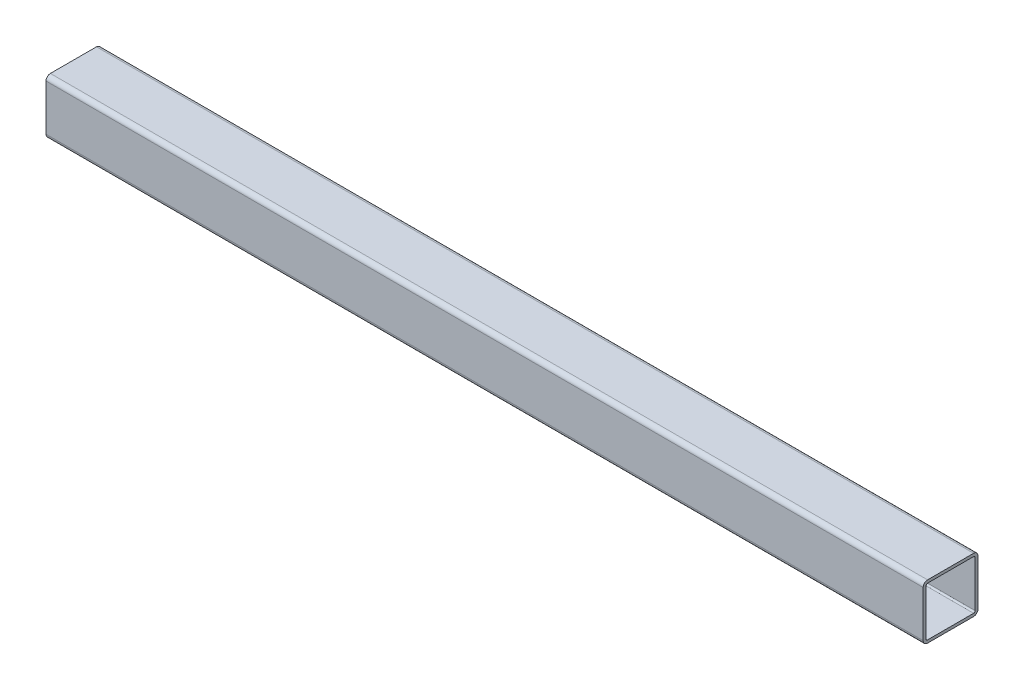
ISO-10303-21;
HEADER;
FILE_DESCRIPTION(('STEP AP214'),'2;1');
FILE_NAME('part.step','',(''),(''),'','','');
FILE_SCHEMA(('AUTOMOTIVE_DESIGN { 1 0 10303 214 1 1 1 1 }'));
ENDSEC;
DATA;
#1=APPLICATION_CONTEXT('core data for automotive mechanical design processes');
#2=APPLICATION_PROTOCOL_DEFINITION('international standard','automotive_design',2000,#1);
#3=PRODUCT_CONTEXT('',#1,'mechanical');
#4=PRODUCT('Part','Part','',(#3));
#5=PRODUCT_RELATED_PRODUCT_CATEGORY('part','',(#4));
#6=PRODUCT_DEFINITION_FORMATION('','',#4);
#7=PRODUCT_DEFINITION_CONTEXT('part definition',#1,'design');
#8=PRODUCT_DEFINITION('design','',#6,#7);
#9=PRODUCT_DEFINITION_SHAPE('','',#8);
#10=(LENGTH_UNIT() NAMED_UNIT(*) SI_UNIT(.MILLI.,.METRE.));
#11=(NAMED_UNIT(*) PLANE_ANGLE_UNIT() SI_UNIT($,.RADIAN.));
#12=(NAMED_UNIT(*) SI_UNIT($,.STERADIAN.) SOLID_ANGLE_UNIT());
#13=UNCERTAINTY_MEASURE_WITH_UNIT(LENGTH_MEASURE(1.E-05),#10,'distance_accuracy_value','');
#14=(GEOMETRIC_REPRESENTATION_CONTEXT(3) GLOBAL_UNCERTAINTY_ASSIGNED_CONTEXT((#13)) GLOBAL_UNIT_ASSIGNED_CONTEXT((#10,
#11,#12)) REPRESENTATION_CONTEXT('',''));
#15=CARTESIAN_POINT('',(0.,0.,0.));
#16=DIRECTION('',(0.,0.,1.));
#17=DIRECTION('',(1.,0.,0.));
#18=AXIS2_PLACEMENT_3D('',#15,#16,#17);
#19=CARTESIAN_POINT('',(203.2,10.541,21.209));
#20=DIRECTION('',(1.,0.,0.));
#21=DIRECTION('',(0.,0.,-1.));
#22=AXIS2_PLACEMENT_3D('',#19,#20,#21);
#23=PLANE('',#22);
#24=CARTESIAN_POINT('',(203.2,10.541,21.209));
#25=DIRECTION('',(1.,0.,0.));
#26=DIRECTION('',(0.,0.,-1.));
#27=AXIS2_PLACEMENT_3D('',#24,#25,#26);
#28=CIRCLE('',#27,1.01599999999999);
#29=CARTESIAN_POINT('',(203.2,10.541,22.225));
#30=VERTEX_POINT('',#29);
#31=CARTESIAN_POINT('',(203.2,9.525,21.209));
#32=VERTEX_POINT('',#31);
#33=EDGE_CURVE('E266',#30,#32,#28,.T.);
#34=ORIENTED_EDGE('',*,*,#33,.T.);
#35=DIRECTION('',(0.,0.,-1.));
#36=VECTOR('',#35,1.);
#37=CARTESIAN_POINT('',(203.2,9.525,21.209));
#38=LINE('',#37,#36);
#39=CARTESIAN_POINT('',(203.2,9.525,10.541));
#40=VERTEX_POINT('',#39);
#41=EDGE_CURVE('E492',#32,#40,#38,.T.);
#42=ORIENTED_EDGE('',*,*,#41,.T.);
#43=CARTESIAN_POINT('',(203.2,10.541,10.541));
#44=DIRECTION('',(1.,0.,0.));
#45=DIRECTION('',(0.,0.,-1.));
#46=AXIS2_PLACEMENT_3D('',#43,#44,#45);
#47=CIRCLE('',#46,1.016);
#48=CARTESIAN_POINT('',(203.2,10.541,9.52499999999999));
#49=VERTEX_POINT('',#48);
#50=EDGE_CURVE('E167',#40,#49,#47,.T.);
#51=ORIENTED_EDGE('',*,*,#50,.T.);
#52=DIRECTION('',(0.,1.,0.));
#53=VECTOR('',#52,1.);
#54=CARTESIAN_POINT('',(203.2,10.541,9.52499999999999));
#55=LINE('',#54,#53);
#56=CARTESIAN_POINT('',(203.2,21.209,9.52499999999999));
#57=VERTEX_POINT('',#56);
#58=EDGE_CURVE('E478',#49,#57,#55,.T.);
#59=ORIENTED_EDGE('',*,*,#58,.T.);
#60=CARTESIAN_POINT('',(203.2,21.209,10.541));
#61=DIRECTION('',(1.,0.,0.));
#62=DIRECTION('',(0.,0.,-1.));
#63=AXIS2_PLACEMENT_3D('',#60,#61,#62);
#64=CIRCLE('',#63,1.016);
#65=CARTESIAN_POINT('',(203.2,22.225,10.541));
#66=VERTEX_POINT('',#65);
#67=EDGE_CURVE('E487',#57,#66,#64,.T.);
#68=ORIENTED_EDGE('',*,*,#67,.T.);
#69=DIRECTION('',(0.,0.,1.));
#70=VECTOR('',#69,1.);
#71=CARTESIAN_POINT('',(203.2,22.225,10.541));
#72=LINE('',#71,#70);
#73=CARTESIAN_POINT('',(203.2,22.225,21.209));
#74=VERTEX_POINT('',#73);
#75=EDGE_CURVE('E282',#66,#74,#72,.T.);
#76=ORIENTED_EDGE('',*,*,#75,.T.);
#77=CARTESIAN_POINT('',(203.2,21.209,21.209));
#78=DIRECTION('',(1.,0.,0.));
#79=DIRECTION('',(0.,0.,-1.));
#80=AXIS2_PLACEMENT_3D('',#77,#78,#79);
#81=CIRCLE('',#80,1.016);
#82=CARTESIAN_POINT('',(203.2,21.209,22.225));
#83=VERTEX_POINT('',#82);
#84=EDGE_CURVE('E299',#74,#83,#81,.T.);
#85=ORIENTED_EDGE('',*,*,#84,.T.);
#86=DIRECTION('',(0.,-1.,0.));
#87=VECTOR('',#86,1.);
#88=CARTESIAN_POINT('',(203.2,21.209,22.225));
#89=LINE('',#88,#87);
#90=EDGE_CURVE('E263',#83,#30,#89,.T.);
#91=ORIENTED_EDGE('',*,*,#90,.T.);
#92=EDGE_LOOP('',(#34,#42,#51,#59,#68,#76,#85,#91));
#93=FACE_BOUND('',#92,.T.);
#94=DIRECTION('',(0.,1.,0.));
#95=VECTOR('',#94,1.);
#96=CARTESIAN_POINT('',(203.2,10.541,10.1854));
#97=LINE('',#96,#95);
#98=CARTESIAN_POINT('',(203.2,10.541,10.1854));
#99=VERTEX_POINT('',#98);
#100=CARTESIAN_POINT('',(203.2,21.209,10.1854));
#101=VERTEX_POINT('',#100);
#102=EDGE_CURVE('E259',#99,#101,#97,.T.);
#103=ORIENTED_EDGE('',*,*,#102,.F.);
#104=CARTESIAN_POINT('',(203.2,10.541,10.541));
#105=DIRECTION('',(1.,0.,0.));
#106=DIRECTION('',(0.,0.,-1.));
#107=AXIS2_PLACEMENT_3D('',#104,#105,#106);
#108=CIRCLE('',#107,0.355599999999999);
#109=CARTESIAN_POINT('',(203.2,10.1854,10.541));
#110=VERTEX_POINT('',#109);
#111=EDGE_CURVE('E106',#110,#99,#108,.T.);
#112=ORIENTED_EDGE('',*,*,#111,.F.);
#113=DIRECTION('',(0.,0.,-1.));
#114=VECTOR('',#113,1.);
#115=CARTESIAN_POINT('',(203.2,10.1854,21.209));
#116=LINE('',#115,#114);
#117=CARTESIAN_POINT('',(203.2,10.1854,21.209));
#118=VERTEX_POINT('',#117);
#119=EDGE_CURVE('E218',#118,#110,#116,.T.);
#120=ORIENTED_EDGE('',*,*,#119,.F.);
#121=CARTESIAN_POINT('',(203.2,10.541,21.209));
#122=DIRECTION('',(1.,1.3324446386157E-13,-1.33244463861569E-13));
#123=DIRECTION('',(-1.3324446386157E-13,1.,0.));
#124=AXIS2_PLACEMENT_3D('',#121,#122,#123);
#125=CIRCLE('',#124,0.355600000000002);
#126=CARTESIAN_POINT('',(203.2,10.541,21.5646));
#127=VERTEX_POINT('',#126);
#128=EDGE_CURVE('E249',#127,#118,#125,.T.);
#129=ORIENTED_EDGE('',*,*,#128,.F.);
#130=DIRECTION('',(0.,-1.,0.));
#131=VECTOR('',#130,1.);
#132=CARTESIAN_POINT('',(203.2,21.209,21.5646));
#133=LINE('',#132,#131);
#134=CARTESIAN_POINT('',(203.2,21.209,21.5646));
#135=VERTEX_POINT('',#134);
#136=EDGE_CURVE('E235',#135,#127,#133,.T.);
#137=ORIENTED_EDGE('',*,*,#136,.F.);
#138=CARTESIAN_POINT('',(203.2,21.209,21.209));
#139=DIRECTION('',(1.,0.,0.));
#140=DIRECTION('',(0.,0.,-1.));
#141=AXIS2_PLACEMENT_3D('',#138,#139,#140);
#142=CIRCLE('',#141,0.355600000000008);
#143=CARTESIAN_POINT('',(203.2,21.5646,21.209));
#144=VERTEX_POINT('',#143);
#145=EDGE_CURVE('E244',#144,#135,#142,.T.);
#146=ORIENTED_EDGE('',*,*,#145,.F.);
#147=DIRECTION('',(0.,0.,1.));
#148=VECTOR('',#147,1.);
#149=CARTESIAN_POINT('',(203.2,21.5646,10.541));
#150=LINE('',#149,#148);
#151=CARTESIAN_POINT('',(203.2,21.5646,10.541));
#152=VERTEX_POINT('',#151);
#153=EDGE_CURVE('E252',#152,#144,#150,.T.);
#154=ORIENTED_EDGE('',*,*,#153,.F.);
#155=CARTESIAN_POINT('',(203.2,21.209,10.541));
#156=DIRECTION('',(1.,1.33244463861569E-13,-1.33244463861569E-13));
#157=DIRECTION('',(-1.33244463861569E-13,0.,-1.));
#158=AXIS2_PLACEMENT_3D('',#155,#156,#157);
#159=CIRCLE('',#158,0.355599999999998);
#160=EDGE_CURVE('E257',#101,#152,#159,.T.);
#161=ORIENTED_EDGE('',*,*,#160,.F.);
#162=EDGE_LOOP('',(#103,#112,#120,#129,#137,#146,#154,#161));
#163=FACE_BOUND('',#162,.T.);
#164=ADVANCED_FACE('F47',(#93,#163),#23,.T.);
#165=CARTESIAN_POINT('',(0.,10.541,21.209));
#166=DIRECTION('',(1.,0.,0.));
#167=DIRECTION('',(0.,0.,-1.));
#168=AXIS2_PLACEMENT_3D('',#165,#166,#167);
#169=PLANE('',#168);
#170=CARTESIAN_POINT('',(0.,10.541,21.209));
#171=DIRECTION('',(1.,0.,0.));
#172=DIRECTION('',(0.,0.,-1.));
#173=AXIS2_PLACEMENT_3D('',#170,#171,#172);
#174=CIRCLE('',#173,1.01599999999999);
#175=CARTESIAN_POINT('',(0.,10.541,22.225));
#176=VERTEX_POINT('',#175);
#177=CARTESIAN_POINT('',(0.,9.525,21.209));
#178=VERTEX_POINT('',#177);
#179=EDGE_CURVE('E160',#176,#178,#174,.T.);
#180=ORIENTED_EDGE('',*,*,#179,.F.);
#181=DIRECTION('',(0.,-1.,0.));
#182=VECTOR('',#181,1.);
#183=CARTESIAN_POINT('',(0.,21.209,22.225));
#184=LINE('',#183,#182);
#185=CARTESIAN_POINT('',(0.,21.209,22.225));
#186=VERTEX_POINT('',#185);
#187=EDGE_CURVE('E264',#186,#176,#184,.T.);
#188=ORIENTED_EDGE('',*,*,#187,.F.);
#189=CARTESIAN_POINT('',(0.,21.209,21.209));
#190=DIRECTION('',(1.,0.,0.));
#191=DIRECTION('',(0.,0.,-1.));
#192=AXIS2_PLACEMENT_3D('',#189,#190,#191);
#193=CIRCLE('',#192,1.016);
#194=CARTESIAN_POINT('',(0.,22.225,21.209));
#195=VERTEX_POINT('',#194);
#196=EDGE_CURVE('E267',#195,#186,#193,.T.);
#197=ORIENTED_EDGE('',*,*,#196,.F.);
#198=DIRECTION('',(0.,0.,1.));
#199=VECTOR('',#198,1.);
#200=CARTESIAN_POINT('',(0.,22.225,10.541));
#201=LINE('',#200,#199);
#202=CARTESIAN_POINT('',(0.,22.225,10.541));
#203=VERTEX_POINT('',#202);
#204=EDGE_CURVE('E269',#203,#195,#201,.T.);
#205=ORIENTED_EDGE('',*,*,#204,.F.);
#206=CARTESIAN_POINT('',(0.,21.209,10.541));
#207=DIRECTION('',(1.,0.,0.));
#208=DIRECTION('',(0.,0.,-1.));
#209=AXIS2_PLACEMENT_3D('',#206,#207,#208);
#210=CIRCLE('',#209,1.016);
#211=CARTESIAN_POINT('',(0.,21.209,9.52499999999999));
#212=VERTEX_POINT('',#211);
#213=EDGE_CURVE('E176',#212,#203,#210,.T.);
#214=ORIENTED_EDGE('',*,*,#213,.F.);
#215=DIRECTION('',(0.,1.,0.));
#216=VECTOR('',#215,1.);
#217=CARTESIAN_POINT('',(0.,10.541,9.52499999999999));
#218=LINE('',#217,#216);
#219=CARTESIAN_POINT('',(0.,10.541,9.52499999999999));
#220=VERTEX_POINT('',#219);
#221=EDGE_CURVE('E174',#220,#212,#218,.T.);
#222=ORIENTED_EDGE('',*,*,#221,.F.);
#223=CARTESIAN_POINT('',(0.,10.541,10.541));
#224=DIRECTION('',(1.,0.,0.));
#225=DIRECTION('',(0.,0.,-1.));
#226=AXIS2_PLACEMENT_3D('',#223,#224,#225);
#227=CIRCLE('',#226,1.016);
#228=CARTESIAN_POINT('',(0.,9.525,10.541));
#229=VERTEX_POINT('',#228);
#230=EDGE_CURVE('E159',#229,#220,#227,.T.);
#231=ORIENTED_EDGE('',*,*,#230,.F.);
#232=DIRECTION('',(0.,0.,-1.));
#233=VECTOR('',#232,1.);
#234=CARTESIAN_POINT('',(0.,9.525,21.209));
#235=LINE('',#234,#233);
#236=EDGE_CURVE('E149',#178,#229,#235,.T.);
#237=ORIENTED_EDGE('',*,*,#236,.F.);
#238=EDGE_LOOP('',(#180,#188,#197,#205,#214,#222,#231,#237));
#239=FACE_BOUND('',#238,.T.);
#240=CARTESIAN_POINT('',(0.,10.541,10.541));
#241=DIRECTION('',(1.,0.,0.));
#242=DIRECTION('',(0.,0.,-1.));
#243=AXIS2_PLACEMENT_3D('',#240,#241,#242);
#244=CIRCLE('',#243,0.355599999999999);
#245=CARTESIAN_POINT('',(0.,10.1854,10.541));
#246=VERTEX_POINT('',#245);
#247=CARTESIAN_POINT('',(0.,10.541,10.1854));
#248=VERTEX_POINT('',#247);
#249=EDGE_CURVE('E72',#246,#248,#244,.T.);
#250=ORIENTED_EDGE('',*,*,#249,.T.);
#251=DIRECTION('',(0.,1.,0.));
#252=VECTOR('',#251,1.);
#253=CARTESIAN_POINT('',(0.,10.541,10.1854));
#254=LINE('',#253,#252);
#255=CARTESIAN_POINT('',(0.,21.209,10.1854));
#256=VERTEX_POINT('',#255);
#257=EDGE_CURVE('E181',#248,#256,#254,.T.);
#258=ORIENTED_EDGE('',*,*,#257,.T.);
#259=CARTESIAN_POINT('',(0.,21.209,10.541));
#260=DIRECTION('',(1.,0.,0.));
#261=DIRECTION('',(0.,0.,-1.));
#262=AXIS2_PLACEMENT_3D('',#259,#260,#261);
#263=CIRCLE('',#262,0.355599999999998);
#264=CARTESIAN_POINT('',(0.,21.5646,10.541));
#265=VERTEX_POINT('',#264);
#266=EDGE_CURVE('E184',#256,#265,#263,.T.);
#267=ORIENTED_EDGE('',*,*,#266,.T.);
#268=DIRECTION('',(0.,0.,1.));
#269=VECTOR('',#268,1.);
#270=CARTESIAN_POINT('',(0.,21.5646,10.541));
#271=LINE('',#270,#269);
#272=CARTESIAN_POINT('',(0.,21.5646,21.209));
#273=VERTEX_POINT('',#272);
#274=EDGE_CURVE('E187',#265,#273,#271,.T.);
#275=ORIENTED_EDGE('',*,*,#274,.T.);
#276=CARTESIAN_POINT('',(0.,21.209,21.209));
#277=DIRECTION('',(1.,0.,0.));
#278=DIRECTION('',(0.,0.,-1.));
#279=AXIS2_PLACEMENT_3D('',#276,#277,#278);
#280=CIRCLE('',#279,0.355600000000008);
#281=CARTESIAN_POINT('',(0.,21.209,21.5646));
#282=VERTEX_POINT('',#281);
#283=EDGE_CURVE('E190',#273,#282,#280,.T.);
#284=ORIENTED_EDGE('',*,*,#283,.T.);
#285=DIRECTION('',(0.,-1.,0.));
#286=VECTOR('',#285,1.);
#287=CARTESIAN_POINT('',(0.,21.209,21.5646));
#288=LINE('',#287,#286);
#289=CARTESIAN_POINT('',(0.,10.541,21.5646));
#290=VERTEX_POINT('',#289);
#291=EDGE_CURVE('E193',#282,#290,#288,.T.);
#292=ORIENTED_EDGE('',*,*,#291,.T.);
#293=CARTESIAN_POINT('',(0.,10.541,21.209));
#294=DIRECTION('',(1.,0.,0.));
#295=DIRECTION('',(0.,0.,-1.));
#296=AXIS2_PLACEMENT_3D('',#293,#294,#295);
#297=CIRCLE('',#296,0.355600000000002);
#298=CARTESIAN_POINT('',(0.,10.1854,21.209));
#299=VERTEX_POINT('',#298);
#300=EDGE_CURVE('E196',#290,#299,#297,.T.);
#301=ORIENTED_EDGE('',*,*,#300,.T.);
#302=DIRECTION('',(0.,0.,-1.));
#303=VECTOR('',#302,1.);
#304=CARTESIAN_POINT('',(0.,10.1854,21.209));
#305=LINE('',#304,#303);
#306=EDGE_CURVE('E199',#299,#246,#305,.T.);
#307=ORIENTED_EDGE('',*,*,#306,.T.);
#308=EDGE_LOOP('',(#250,#258,#267,#275,#284,#292,#301,#307));
#309=FACE_BOUND('',#308,.T.);
#310=ADVANCED_FACE('F171',(#239,#309),#169,.F.);
#311=CARTESIAN_POINT('',(203.2,10.541,21.209));
#312=DIRECTION('',(-1.,0.,0.));
#313=DIRECTION('',(0.,0.,1.));
#314=AXIS2_PLACEMENT_3D('',#311,#312,#313);
#315=CYLINDRICAL_SURFACE('',#314,1.016);
#316=ORIENTED_EDGE('',*,*,#179,.T.);
#317=DIRECTION('',(-1.,0.,0.));
#318=VECTOR('',#317,1.);
#319=CARTESIAN_POINT('',(203.2,9.525,21.209));
#320=LINE('',#319,#318);
#321=EDGE_CURVE('E11',#32,#178,#320,.T.);
#322=ORIENTED_EDGE('',*,*,#321,.F.);
#323=ORIENTED_EDGE('',*,*,#33,.F.);
#324=DIRECTION('',(-1.,0.,0.));
#325=VECTOR('',#324,1.);
#326=CARTESIAN_POINT('',(203.2,10.541,22.225));
#327=LINE('',#326,#325);
#328=EDGE_CURVE('E215',#30,#176,#327,.T.);
#329=ORIENTED_EDGE('',*,*,#328,.T.);
#330=EDGE_LOOP('',(#316,#322,#323,#329));
#331=FACE_BOUND('',#330,.T.);
#332=ADVANCED_FACE('F329',(#331),#315,.T.);
#333=CARTESIAN_POINT('',(203.2,9.525,21.209));
#334=DIRECTION('',(0.,1.,0.));
#335=DIRECTION('',(0.,0.,1.));
#336=AXIS2_PLACEMENT_3D('',#333,#334,#335);
#337=PLANE('',#336);
#338=ORIENTED_EDGE('',*,*,#236,.T.);
#339=DIRECTION('',(-1.,0.,0.));
#340=VECTOR('',#339,1.);
#341=CARTESIAN_POINT('',(203.2,9.525,10.541));
#342=LINE('',#341,#340);
#343=EDGE_CURVE('E56',#40,#229,#342,.T.);
#344=ORIENTED_EDGE('',*,*,#343,.F.);
#345=ORIENTED_EDGE('',*,*,#41,.F.);
#346=ORIENTED_EDGE('',*,*,#321,.T.);
#347=EDGE_LOOP('',(#338,#344,#345,#346));
#348=FACE_BOUND('',#347,.T.);
#349=ADVANCED_FACE('F153',(#348),#337,.F.);
#350=CARTESIAN_POINT('',(203.2,10.541,10.541));
#351=DIRECTION('',(-1.,0.,0.));
#352=DIRECTION('',(0.,0.,1.));
#353=AXIS2_PLACEMENT_3D('',#350,#351,#352);
#354=CYLINDRICAL_SURFACE('',#353,1.016);
#355=ORIENTED_EDGE('',*,*,#230,.T.);
#356=DIRECTION('',(-1.,0.,0.));
#357=VECTOR('',#356,1.);
#358=CARTESIAN_POINT('',(203.2,10.541,9.52499999999999));
#359=LINE('',#358,#357);
#360=EDGE_CURVE('E168',#49,#220,#359,.T.);
#361=ORIENTED_EDGE('',*,*,#360,.F.);
#362=ORIENTED_EDGE('',*,*,#50,.F.);
#363=ORIENTED_EDGE('',*,*,#343,.T.);
#364=EDGE_LOOP('',(#355,#361,#362,#363));
#365=FACE_BOUND('',#364,.T.);
#366=ADVANCED_FACE('F163',(#365),#354,.T.);
#367=CARTESIAN_POINT('',(203.2,10.541,9.52499999999999));
#368=DIRECTION('',(0.,0.,1.));
#369=DIRECTION('',(1.,0.,0.));
#370=AXIS2_PLACEMENT_3D('',#367,#368,#369);
#371=PLANE('',#370);
#372=ORIENTED_EDGE('',*,*,#221,.T.);
#373=DIRECTION('',(-1.,0.,0.));
#374=VECTOR('',#373,1.);
#375=CARTESIAN_POINT('',(203.2,21.209,9.52499999999999));
#376=LINE('',#375,#374);
#377=EDGE_CURVE('E203',#57,#212,#376,.T.);
#378=ORIENTED_EDGE('',*,*,#377,.F.);
#379=ORIENTED_EDGE('',*,*,#58,.F.);
#380=ORIENTED_EDGE('',*,*,#360,.T.);
#381=EDGE_LOOP('',(#372,#378,#379,#380));
#382=FACE_BOUND('',#381,.T.);
#383=ADVANCED_FACE('F339',(#382),#371,.F.);
#384=CARTESIAN_POINT('',(203.2,21.209,10.541));
#385=DIRECTION('',(-1.,0.,0.));
#386=DIRECTION('',(0.,0.,1.));
#387=AXIS2_PLACEMENT_3D('',#384,#385,#386);
#388=CYLINDRICAL_SURFACE('',#387,1.016);
#389=ORIENTED_EDGE('',*,*,#213,.T.);
#390=DIRECTION('',(-1.,0.,0.));
#391=VECTOR('',#390,1.);
#392=CARTESIAN_POINT('',(203.2,22.225,10.541));
#393=LINE('',#392,#391);
#394=EDGE_CURVE('E206',#66,#203,#393,.T.);
#395=ORIENTED_EDGE('',*,*,#394,.F.);
#396=ORIENTED_EDGE('',*,*,#67,.F.);
#397=ORIENTED_EDGE('',*,*,#377,.T.);
#398=EDGE_LOOP('',(#389,#395,#396,#397));
#399=FACE_BOUND('',#398,.T.);
#400=ADVANCED_FACE('F272',(#399),#388,.T.);
#401=CARTESIAN_POINT('',(203.2,22.225,10.541));
#402=DIRECTION('',(0.,-1.,0.));
#403=DIRECTION('',(0.,0.,-1.));
#404=AXIS2_PLACEMENT_3D('',#401,#402,#403);
#405=PLANE('',#404);
#406=ORIENTED_EDGE('',*,*,#204,.T.);
#407=DIRECTION('',(-1.,0.,0.));
#408=VECTOR('',#407,1.);
#409=CARTESIAN_POINT('',(203.2,22.225,21.209));
#410=LINE('',#409,#408);
#411=EDGE_CURVE('E209',#74,#195,#410,.T.);
#412=ORIENTED_EDGE('',*,*,#411,.F.);
#413=ORIENTED_EDGE('',*,*,#75,.F.);
#414=ORIENTED_EDGE('',*,*,#394,.T.);
#415=EDGE_LOOP('',(#406,#412,#413,#414));
#416=FACE_BOUND('',#415,.T.);
#417=ADVANCED_FACE('F279',(#416),#405,.F.);
#418=CARTESIAN_POINT('',(203.2,21.209,21.209));
#419=DIRECTION('',(-1.,0.,0.));
#420=DIRECTION('',(0.,0.,1.));
#421=AXIS2_PLACEMENT_3D('',#418,#419,#420);
#422=CYLINDRICAL_SURFACE('',#421,1.016);
#423=ORIENTED_EDGE('',*,*,#196,.T.);
#424=DIRECTION('',(-1.,0.,0.));
#425=VECTOR('',#424,1.);
#426=CARTESIAN_POINT('',(203.2,21.209,22.225));
#427=LINE('',#426,#425);
#428=EDGE_CURVE('E212',#83,#186,#427,.T.);
#429=ORIENTED_EDGE('',*,*,#428,.F.);
#430=ORIENTED_EDGE('',*,*,#84,.F.);
#431=ORIENTED_EDGE('',*,*,#411,.T.);
#432=EDGE_LOOP('',(#423,#429,#430,#431));
#433=FACE_BOUND('',#432,.T.);
#434=ADVANCED_FACE('F287',(#433),#422,.T.);
#435=CARTESIAN_POINT('',(203.2,21.209,22.225));
#436=DIRECTION('',(0.,0.,-1.));
#437=DIRECTION('',(0.,1.,0.));
#438=AXIS2_PLACEMENT_3D('',#435,#436,#437);
#439=PLANE('',#438);
#440=ORIENTED_EDGE('',*,*,#187,.T.);
#441=ORIENTED_EDGE('',*,*,#328,.F.);
#442=ORIENTED_EDGE('',*,*,#90,.F.);
#443=ORIENTED_EDGE('',*,*,#428,.T.);
#444=EDGE_LOOP('',(#440,#441,#442,#443));
#445=FACE_BOUND('',#444,.T.);
#446=ADVANCED_FACE('F291',(#445),#439,.F.);
#447=CARTESIAN_POINT('',(203.2,10.541,10.541));
#448=DIRECTION('',(-1.,0.,0.));
#449=DIRECTION('',(0.,0.,1.));
#450=AXIS2_PLACEMENT_3D('',#447,#448,#449);
#451=CYLINDRICAL_SURFACE('',#450,0.3556);
#452=ORIENTED_EDGE('',*,*,#249,.F.);
#453=DIRECTION('',(-1.,0.,0.));
#454=VECTOR('',#453,1.);
#455=CARTESIAN_POINT('',(203.2,10.1854,10.541));
#456=LINE('',#455,#454);
#457=EDGE_CURVE('E216',#110,#246,#456,.T.);
#458=ORIENTED_EDGE('',*,*,#457,.F.);
#459=ORIENTED_EDGE('',*,*,#111,.T.);
#460=DIRECTION('',(-1.,0.,0.));
#461=VECTOR('',#460,1.);
#462=CARTESIAN_POINT('',(203.2,10.541,10.1854));
#463=LINE('',#462,#461);
#464=EDGE_CURVE('E219',#99,#248,#463,.T.);
#465=ORIENTED_EDGE('',*,*,#464,.T.);
#466=EDGE_LOOP('',(#452,#458,#459,#465));
#467=FACE_BOUND('',#466,.T.);
#468=ADVANCED_FACE('F305',(#467),#451,.F.);
#469=CARTESIAN_POINT('',(203.2,10.541,10.1854));
#470=DIRECTION('',(0.,0.,1.));
#471=DIRECTION('',(1.,0.,0.));
#472=AXIS2_PLACEMENT_3D('',#469,#470,#471);
#473=PLANE('',#472);
#474=ORIENTED_EDGE('',*,*,#257,.F.);
#475=ORIENTED_EDGE('',*,*,#464,.F.);
#476=ORIENTED_EDGE('',*,*,#102,.T.);
#477=DIRECTION('',(-1.,0.,0.));
#478=VECTOR('',#477,1.);
#479=CARTESIAN_POINT('',(203.2,21.209,10.1854));
#480=LINE('',#479,#478);
#481=EDGE_CURVE('E221',#101,#256,#480,.T.);
#482=ORIENTED_EDGE('',*,*,#481,.T.);
#483=EDGE_LOOP('',(#474,#475,#476,#482));
#484=FACE_BOUND('',#483,.T.);
#485=ADVANCED_FACE('F309',(#484),#473,.T.);
#486=CARTESIAN_POINT('',(203.2,21.209,10.541));
#487=DIRECTION('',(-1.,0.,0.));
#488=DIRECTION('',(0.,0.,1.));
#489=AXIS2_PLACEMENT_3D('',#486,#487,#488);
#490=CYLINDRICAL_SURFACE('',#489,0.3556);
#491=ORIENTED_EDGE('',*,*,#266,.F.);
#492=ORIENTED_EDGE('',*,*,#481,.F.);
#493=ORIENTED_EDGE('',*,*,#160,.T.);
#494=DIRECTION('',(-1.,0.,0.));
#495=VECTOR('',#494,1.);
#496=CARTESIAN_POINT('',(203.2,21.5646,10.541));
#497=LINE('',#496,#495);
#498=EDGE_CURVE('E223',#152,#265,#497,.T.);
#499=ORIENTED_EDGE('',*,*,#498,.T.);
#500=EDGE_LOOP('',(#491,#492,#493,#499));
#501=FACE_BOUND('',#500,.T.);
#502=ADVANCED_FACE('F312',(#501),#490,.F.);
#503=CARTESIAN_POINT('',(203.2,21.5646,10.541));
#504=DIRECTION('',(0.,-1.,0.));
#505=DIRECTION('',(0.,0.,-1.));
#506=AXIS2_PLACEMENT_3D('',#503,#504,#505);
#507=PLANE('',#506);
#508=ORIENTED_EDGE('',*,*,#274,.F.);
#509=ORIENTED_EDGE('',*,*,#498,.F.);
#510=ORIENTED_EDGE('',*,*,#153,.T.);
#511=DIRECTION('',(-1.,0.,0.));
#512=VECTOR('',#511,1.);
#513=CARTESIAN_POINT('',(203.2,21.5646,21.209));
#514=LINE('',#513,#512);
#515=EDGE_CURVE('E225',#144,#273,#514,.T.);
#516=ORIENTED_EDGE('',*,*,#515,.T.);
#517=EDGE_LOOP('',(#508,#509,#510,#516));
#518=FACE_BOUND('',#517,.T.);
#519=ADVANCED_FACE('F315',(#518),#507,.T.);
#520=CARTESIAN_POINT('',(203.2,21.209,21.209));
#521=DIRECTION('',(-1.,0.,0.));
#522=DIRECTION('',(0.,0.,1.));
#523=AXIS2_PLACEMENT_3D('',#520,#521,#522);
#524=CYLINDRICAL_SURFACE('',#523,0.355600000000001);
#525=ORIENTED_EDGE('',*,*,#283,.F.);
#526=ORIENTED_EDGE('',*,*,#515,.F.);
#527=ORIENTED_EDGE('',*,*,#145,.T.);
#528=DIRECTION('',(-1.,0.,0.));
#529=VECTOR('',#528,1.);
#530=CARTESIAN_POINT('',(203.2,21.209,21.5646));
#531=LINE('',#530,#529);
#532=EDGE_CURVE('E227',#135,#282,#531,.T.);
#533=ORIENTED_EDGE('',*,*,#532,.T.);
#534=EDGE_LOOP('',(#525,#526,#527,#533));
#535=FACE_BOUND('',#534,.T.);
#536=ADVANCED_FACE('F242',(#535),#524,.F.);
#537=CARTESIAN_POINT('',(203.2,21.209,21.5646));
#538=DIRECTION('',(0.,0.,-1.));
#539=DIRECTION('',(-1.,0.,0.));
#540=AXIS2_PLACEMENT_3D('',#537,#538,#539);
#541=PLANE('',#540);
#542=ORIENTED_EDGE('',*,*,#291,.F.);
#543=ORIENTED_EDGE('',*,*,#532,.F.);
#544=ORIENTED_EDGE('',*,*,#136,.T.);
#545=DIRECTION('',(-1.,0.,0.));
#546=VECTOR('',#545,1.);
#547=CARTESIAN_POINT('',(203.2,10.541,21.5646));
#548=LINE('',#547,#546);
#549=EDGE_CURVE('E228',#127,#290,#548,.T.);
#550=ORIENTED_EDGE('',*,*,#549,.T.);
#551=EDGE_LOOP('',(#542,#543,#544,#550));
#552=FACE_BOUND('',#551,.T.);
#553=ADVANCED_FACE('F232',(#552),#541,.T.);
#554=CARTESIAN_POINT('',(203.2,10.541,21.209));
#555=DIRECTION('',(-1.,0.,0.));
#556=DIRECTION('',(0.,0.,1.));
#557=AXIS2_PLACEMENT_3D('',#554,#555,#556);
#558=CYLINDRICAL_SURFACE('',#557,0.355600000000003);
#559=ORIENTED_EDGE('',*,*,#300,.F.);
#560=ORIENTED_EDGE('',*,*,#549,.F.);
#561=ORIENTED_EDGE('',*,*,#128,.T.);
#562=DIRECTION('',(-1.,0.,0.));
#563=VECTOR('',#562,1.);
#564=CARTESIAN_POINT('',(203.2,10.1854,21.209));
#565=LINE('',#564,#563);
#566=EDGE_CURVE('E51',#118,#299,#565,.T.);
#567=ORIENTED_EDGE('',*,*,#566,.T.);
#568=EDGE_LOOP('',(#559,#560,#561,#567));
#569=FACE_BOUND('',#568,.T.);
#570=ADVANCED_FACE('F237',(#569),#558,.F.);
#571=CARTESIAN_POINT('',(203.2,10.1854,21.209));
#572=DIRECTION('',(0.,1.,0.));
#573=DIRECTION('',(0.,0.,1.));
#574=AXIS2_PLACEMENT_3D('',#571,#572,#573);
#575=PLANE('',#574);
#576=ORIENTED_EDGE('',*,*,#306,.F.);
#577=ORIENTED_EDGE('',*,*,#566,.F.);
#578=ORIENTED_EDGE('',*,*,#119,.T.);
#579=ORIENTED_EDGE('',*,*,#457,.T.);
#580=EDGE_LOOP('',(#576,#577,#578,#579));
#581=FACE_BOUND('',#580,.T.);
#582=ADVANCED_FACE('F49',(#581),#575,.T.);
#583=CLOSED_SHELL('',(#164,#310,#332,#349,#366,#383,#400,#417,#434,#446,#468,#485,#502,#519,
#536,#553,#570,#582));
#584=MANIFOLD_SOLID_BREP('B2',#583);
#585=ADVANCED_BREP_SHAPE_REPRESENTATION('',(#18,#584),#14);
#586=SHAPE_DEFINITION_REPRESENTATION(#9,#585);
ENDSEC;
END-ISO-10303-21;
